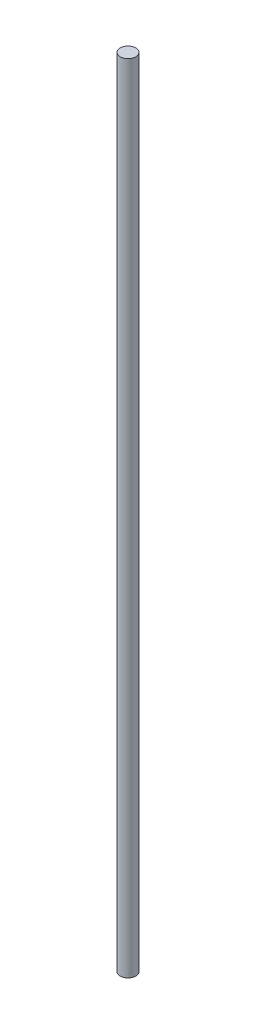
ISO-10303-21;
HEADER;
FILE_DESCRIPTION(('STEP AP214'),'2;1');
FILE_NAME('part.step','',(''),(''),'','','');
FILE_SCHEMA(('AUTOMOTIVE_DESIGN { 1 0 10303 214 1 1 1 1 }'));
ENDSEC;
DATA;
#1=APPLICATION_CONTEXT('core data for automotive mechanical design processes');
#2=APPLICATION_PROTOCOL_DEFINITION('international standard','automotive_design',2000,#1);
#3=PRODUCT_CONTEXT('',#1,'mechanical');
#4=PRODUCT('Part','Part','',(#3));
#5=PRODUCT_RELATED_PRODUCT_CATEGORY('part','',(#4));
#6=PRODUCT_DEFINITION_FORMATION('','',#4);
#7=PRODUCT_DEFINITION_CONTEXT('part definition',#1,'design');
#8=PRODUCT_DEFINITION('design','',#6,#7);
#9=PRODUCT_DEFINITION_SHAPE('','',#8);
#10=(LENGTH_UNIT() NAMED_UNIT(*) SI_UNIT(.MILLI.,.METRE.));
#11=(NAMED_UNIT(*) PLANE_ANGLE_UNIT() SI_UNIT($,.RADIAN.));
#12=(NAMED_UNIT(*) SI_UNIT($,.STERADIAN.) SOLID_ANGLE_UNIT());
#13=UNCERTAINTY_MEASURE_WITH_UNIT(LENGTH_MEASURE(1.E-05),#10,'distance_accuracy_value','');
#14=(GEOMETRIC_REPRESENTATION_CONTEXT(3) GLOBAL_UNCERTAINTY_ASSIGNED_CONTEXT((#13)) GLOBAL_UNIT_ASSIGNED_CONTEXT((#10,
#11,#12)) REPRESENTATION_CONTEXT('',''));
#15=CARTESIAN_POINT('',(0.,0.,0.));
#16=DIRECTION('',(0.,0.,1.));
#17=DIRECTION('',(1.,0.,0.));
#18=AXIS2_PLACEMENT_3D('',#15,#16,#17);
#19=CARTESIAN_POINT('',(0.,247.65,0.));
#20=DIRECTION('',(0.,-1.,0.));
#21=DIRECTION('',(0.,0.,-1.));
#22=AXIS2_PLACEMENT_3D('',#19,#20,#21);
#23=CYLINDRICAL_SURFACE('',#22,2.413);
#24=CARTESIAN_POINT('',(0.,247.65,0.));
#25=DIRECTION('',(0.,1.,0.));
#26=DIRECTION('',(0.,0.,1.));
#27=AXIS2_PLACEMENT_3D('',#24,#25,#26);
#28=CIRCLE('',#27,2.413);
#29=CARTESIAN_POINT('',(0.,247.65,2.413));
#30=VERTEX_POINT('',#29);
#31=EDGE_CURVE('E10',#30,#30,#28,.T.);
#32=ORIENTED_EDGE('',*,*,#31,.F.);
#33=EDGE_LOOP('',(#32));
#34=FACE_BOUND('',#33,.T.);
#35=CARTESIAN_POINT('',(0.,0.,0.));
#36=DIRECTION('',(0.,1.,0.));
#37=DIRECTION('',(0.,0.,1.));
#38=AXIS2_PLACEMENT_3D('',#35,#36,#37);
#39=CIRCLE('',#38,2.413);
#40=CARTESIAN_POINT('',(0.,0.,2.413));
#41=VERTEX_POINT('',#40);
#42=EDGE_CURVE('E44',#41,#41,#39,.T.);
#43=ORIENTED_EDGE('',*,*,#42,.T.);
#44=EDGE_LOOP('',(#43));
#45=FACE_BOUND('',#44,.T.);
#46=ADVANCED_FACE('F41',(#34,#45),#23,.T.);
#47=CARTESIAN_POINT('',(0.,247.65,0.));
#48=DIRECTION('',(0.,1.,0.));
#49=DIRECTION('',(0.,0.,1.));
#50=AXIS2_PLACEMENT_3D('',#47,#48,#49);
#51=PLANE('',#50);
#52=ORIENTED_EDGE('',*,*,#31,.T.);
#53=EDGE_LOOP('',(#52));
#54=FACE_BOUND('',#53,.T.);
#55=ADVANCED_FACE('F58',(#54),#51,.T.);
#56=CARTESIAN_POINT('',(0.,0.,0.));
#57=DIRECTION('',(0.,1.,0.));
#58=DIRECTION('',(0.,0.,1.));
#59=AXIS2_PLACEMENT_3D('',#56,#57,#58);
#60=PLANE('',#59);
#61=ORIENTED_EDGE('',*,*,#42,.F.);
#62=EDGE_LOOP('',(#61));
#63=FACE_BOUND('',#62,.T.);
#64=ADVANCED_FACE('F56',(#63),#60,.F.);
#65=CLOSED_SHELL('',(#46,#55,#64));
#66=MANIFOLD_SOLID_BREP('B2',#65);
#67=ADVANCED_BREP_SHAPE_REPRESENTATION('',(#18,#66),#14);
#68=SHAPE_DEFINITION_REPRESENTATION(#9,#67);
ENDSEC;
END-ISO-10303-21;
